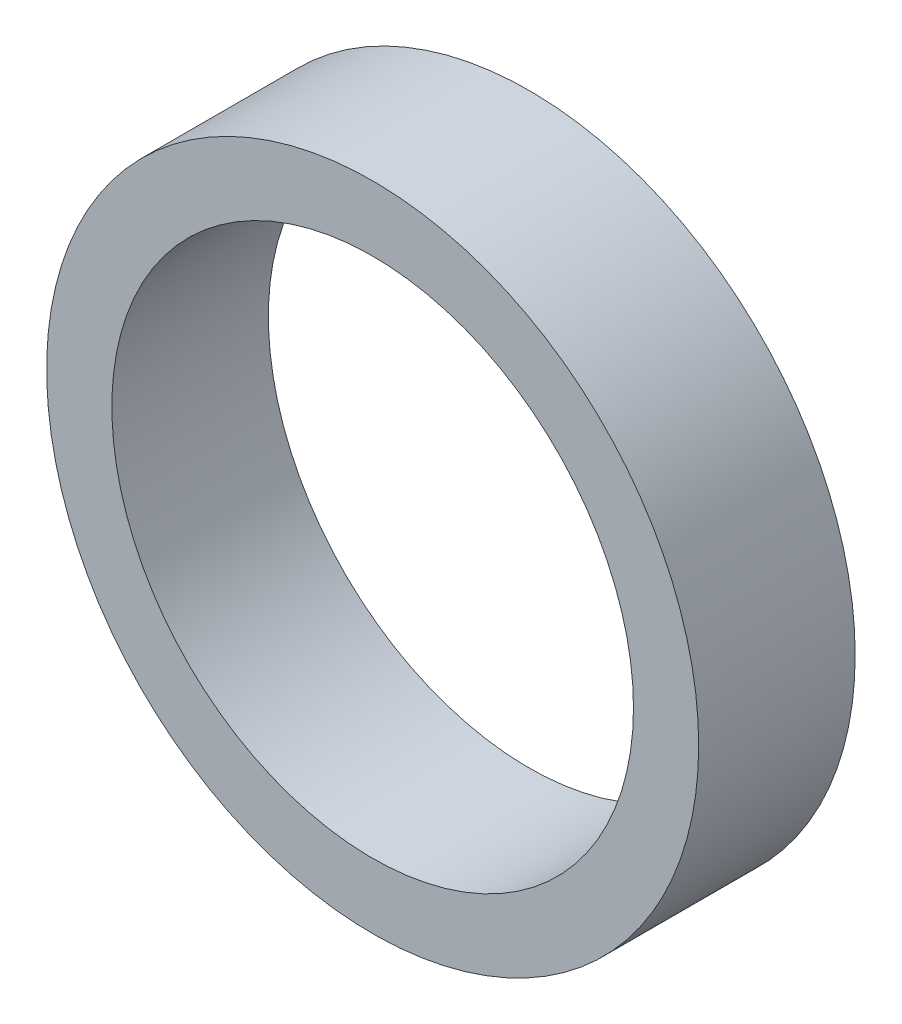
ISO-10303-21;
HEADER;
FILE_DESCRIPTION(('STEP AP214'),'2;1');
FILE_NAME('part.step','',(''),(''),'','','');
FILE_SCHEMA(('AUTOMOTIVE_DESIGN { 1 0 10303 214 1 1 1 1 }'));
ENDSEC;
DATA;
#1=APPLICATION_CONTEXT('core data for automotive mechanical design processes');
#2=APPLICATION_PROTOCOL_DEFINITION('international standard','automotive_design',2000,#1);
#3=PRODUCT_CONTEXT('',#1,'mechanical');
#4=PRODUCT('Part','Part','',(#3));
#5=PRODUCT_RELATED_PRODUCT_CATEGORY('part','',(#4));
#6=PRODUCT_DEFINITION_FORMATION('','',#4);
#7=PRODUCT_DEFINITION_CONTEXT('part definition',#1,'design');
#8=PRODUCT_DEFINITION('design','',#6,#7);
#9=PRODUCT_DEFINITION_SHAPE('','',#8);
#10=(LENGTH_UNIT() NAMED_UNIT(*) SI_UNIT(.MILLI.,.METRE.));
#11=(NAMED_UNIT(*) PLANE_ANGLE_UNIT() SI_UNIT($,.RADIAN.));
#12=(NAMED_UNIT(*) SI_UNIT($,.STERADIAN.) SOLID_ANGLE_UNIT());
#13=UNCERTAINTY_MEASURE_WITH_UNIT(LENGTH_MEASURE(1.E-05),#10,'distance_accuracy_value','');
#14=(GEOMETRIC_REPRESENTATION_CONTEXT(3) GLOBAL_UNCERTAINTY_ASSIGNED_CONTEXT((#13)) GLOBAL_UNIT_ASSIGNED_CONTEXT((#10,
#11,#12)) REPRESENTATION_CONTEXT('',''));
#15=CARTESIAN_POINT('',(0.,0.,0.));
#16=DIRECTION('',(0.,0.,1.));
#17=DIRECTION('',(1.,0.,0.));
#18=AXIS2_PLACEMENT_3D('',#15,#16,#17);
#19=CARTESIAN_POINT('',(0.,0.,3.6));
#20=DIRECTION('',(0.,0.,1.));
#21=DIRECTION('',(1.,0.,0.));
#22=AXIS2_PLACEMENT_3D('',#19,#20,#21);
#23=PLANE('',#22);
#24=CARTESIAN_POINT('',(0.,0.,3.6));
#25=DIRECTION('',(0.,0.,1.));
#26=DIRECTION('',(1.,0.,0.));
#27=AXIS2_PLACEMENT_3D('',#24,#25,#26);
#28=CIRCLE('',#27,7.5);
#29=CARTESIAN_POINT('',(7.5,0.,3.6));
#30=VERTEX_POINT('',#29);
#31=EDGE_CURVE('E10',#30,#30,#28,.T.);
#32=ORIENTED_EDGE('',*,*,#31,.T.);
#33=EDGE_LOOP('',(#32));
#34=FACE_BOUND('',#33,.T.);
#35=CARTESIAN_POINT('',(0.,0.,3.6));
#36=DIRECTION('',(0.,0.,1.));
#37=DIRECTION('',(1.,0.,0.));
#38=AXIS2_PLACEMENT_3D('',#35,#36,#37);
#39=CIRCLE('',#38,6.);
#40=CARTESIAN_POINT('',(6.,0.,3.6));
#41=VERTEX_POINT('',#40);
#42=EDGE_CURVE('E48',#41,#41,#39,.T.);
#43=ORIENTED_EDGE('',*,*,#42,.F.);
#44=EDGE_LOOP('',(#43));
#45=FACE_BOUND('',#44,.T.);
#46=ADVANCED_FACE('F37',(#34,#45),#23,.T.);
#47=CARTESIAN_POINT('',(0.,0.,0.));
#48=DIRECTION('',(0.,0.,1.));
#49=DIRECTION('',(1.,0.,0.));
#50=AXIS2_PLACEMENT_3D('',#47,#48,#49);
#51=PLANE('',#50);
#52=CARTESIAN_POINT('',(0.,0.,0.));
#53=DIRECTION('',(0.,0.,1.));
#54=DIRECTION('',(1.,0.,0.));
#55=AXIS2_PLACEMENT_3D('',#52,#53,#54);
#56=CIRCLE('',#55,7.5);
#57=CARTESIAN_POINT('',(7.5,0.,0.));
#58=VERTEX_POINT('',#57);
#59=EDGE_CURVE('E41',#58,#58,#56,.T.);
#60=ORIENTED_EDGE('',*,*,#59,.F.);
#61=EDGE_LOOP('',(#60));
#62=FACE_BOUND('',#61,.T.);
#63=CARTESIAN_POINT('',(0.,0.,0.));
#64=DIRECTION('',(0.,0.,1.));
#65=DIRECTION('',(1.,0.,0.));
#66=AXIS2_PLACEMENT_3D('',#63,#64,#65);
#67=CIRCLE('',#66,6.);
#68=CARTESIAN_POINT('',(6.,0.,0.));
#69=VERTEX_POINT('',#68);
#70=EDGE_CURVE('E50',#69,#69,#67,.T.);
#71=ORIENTED_EDGE('',*,*,#70,.T.);
#72=EDGE_LOOP('',(#71));
#73=FACE_BOUND('',#72,.T.);
#74=ADVANCED_FACE('F60',(#62,#73),#51,.F.);
#75=CARTESIAN_POINT('',(0.,0.,3.6));
#76=DIRECTION('',(0.,0.,-1.));
#77=DIRECTION('',(-1.,0.,0.));
#78=AXIS2_PLACEMENT_3D('',#75,#76,#77);
#79=CYLINDRICAL_SURFACE('',#78,7.5);
#80=ORIENTED_EDGE('',*,*,#31,.F.);
#81=EDGE_LOOP('',(#80));
#82=FACE_BOUND('',#81,.T.);
#83=ORIENTED_EDGE('',*,*,#59,.T.);
#84=EDGE_LOOP('',(#83));
#85=FACE_BOUND('',#84,.T.);
#86=ADVANCED_FACE('F39',(#82,#85),#79,.T.);
#87=CARTESIAN_POINT('',(0.,0.,3.6));
#88=DIRECTION('',(0.,0.,-1.));
#89=DIRECTION('',(-1.,0.,0.));
#90=AXIS2_PLACEMENT_3D('',#87,#88,#89);
#91=CYLINDRICAL_SURFACE('',#90,6.);
#92=ORIENTED_EDGE('',*,*,#42,.T.);
#93=EDGE_LOOP('',(#92));
#94=FACE_BOUND('',#93,.T.);
#95=ORIENTED_EDGE('',*,*,#70,.F.);
#96=EDGE_LOOP('',(#95));
#97=FACE_BOUND('',#96,.T.);
#98=ADVANCED_FACE('F56',(#94,#97),#91,.F.);
#99=CLOSED_SHELL('',(#46,#74,#86,#98));
#100=MANIFOLD_SOLID_BREP('B2',#99);
#101=ADVANCED_BREP_SHAPE_REPRESENTATION('',(#18,#100),#14);
#102=SHAPE_DEFINITION_REPRESENTATION(#9,#101);
ENDSEC;
END-ISO-10303-21;
